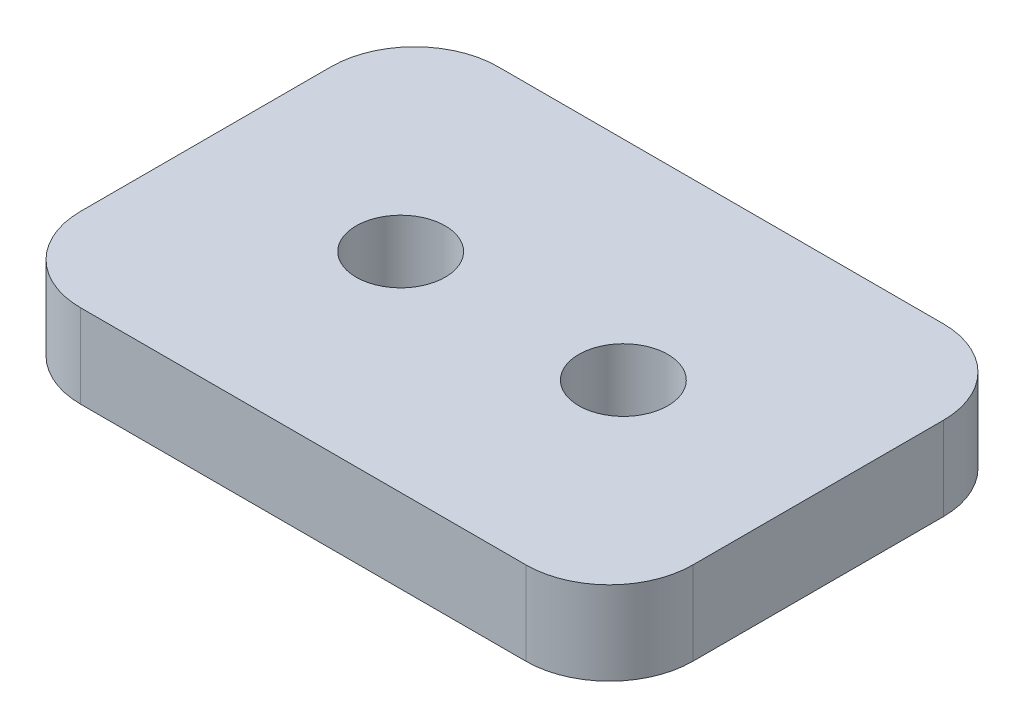
ISO-10303-21;
HEADER;
FILE_DESCRIPTION(('STEP AP214'),'2;1');
FILE_NAME('part.step','',(''),(''),'','','');
FILE_SCHEMA(('AUTOMOTIVE_DESIGN { 1 0 10303 214 1 1 1 1 }'));
ENDSEC;
DATA;
#1=APPLICATION_CONTEXT('core data for automotive mechanical design processes');
#2=APPLICATION_PROTOCOL_DEFINITION('international standard','automotive_design',2000,#1);
#3=PRODUCT_CONTEXT('',#1,'mechanical');
#4=PRODUCT('Part','Part','',(#3));
#5=PRODUCT_RELATED_PRODUCT_CATEGORY('part','',(#4));
#6=PRODUCT_DEFINITION_FORMATION('','',#4);
#7=PRODUCT_DEFINITION_CONTEXT('part definition',#1,'design');
#8=PRODUCT_DEFINITION('design','',#6,#7);
#9=PRODUCT_DEFINITION_SHAPE('','',#8);
#10=(LENGTH_UNIT() NAMED_UNIT(*) SI_UNIT(.MILLI.,.METRE.));
#11=(NAMED_UNIT(*) PLANE_ANGLE_UNIT() SI_UNIT($,.RADIAN.));
#12=(NAMED_UNIT(*) SI_UNIT($,.STERADIAN.) SOLID_ANGLE_UNIT());
#13=UNCERTAINTY_MEASURE_WITH_UNIT(LENGTH_MEASURE(1.E-05),#10,'distance_accuracy_value','');
#14=(GEOMETRIC_REPRESENTATION_CONTEXT(3) GLOBAL_UNCERTAINTY_ASSIGNED_CONTEXT((#13)) GLOBAL_UNIT_ASSIGNED_CONTEXT((#10,
#11,#12)) REPRESENTATION_CONTEXT('',''));
#15=CARTESIAN_POINT('',(0.,0.,0.));
#16=DIRECTION('',(0.,0.,1.));
#17=DIRECTION('',(1.,0.,0.));
#18=AXIS2_PLACEMENT_3D('',#15,#16,#17);
#19=CARTESIAN_POINT('',(0.,3.,0.));
#20=DIRECTION('',(0.,-1.,0.));
#21=DIRECTION('',(0.,0.,-1.));
#22=AXIS2_PLACEMENT_3D('',#19,#20,#21);
#23=PLANE('',#22);
#24=DIRECTION('',(0.,0.,1.));
#25=VECTOR('',#24,1.);
#26=CARTESIAN_POINT('',(-11.,3.,7.5));
#27=LINE('',#26,#25);
#28=CARTESIAN_POINT('',(-11.,3.,-4.5));
#29=VERTEX_POINT('',#28);
#30=CARTESIAN_POINT('',(-11.,3.,4.5));
#31=VERTEX_POINT('',#30);
#32=EDGE_CURVE('E181',#29,#31,#27,.T.);
#33=ORIENTED_EDGE('',*,*,#32,.T.);
#34=CARTESIAN_POINT('',(-8.,3.,4.5));
#35=DIRECTION('',(0.,-1.,0.));
#36=DIRECTION('',(0.,0.,-1.));
#37=AXIS2_PLACEMENT_3D('',#34,#35,#36);
#38=CIRCLE('',#37,3.);
#39=CARTESIAN_POINT('',(-8.,3.,7.5));
#40=VERTEX_POINT('',#39);
#41=EDGE_CURVE('E158',#31,#40,#38,.F.);
#42=ORIENTED_EDGE('',*,*,#41,.T.);
#43=DIRECTION('',(1.,0.,0.));
#44=VECTOR('',#43,1.);
#45=CARTESIAN_POINT('',(-11.,3.,7.5));
#46=LINE('',#45,#44);
#47=CARTESIAN_POINT('',(7.99999999999999,3.,7.5));
#48=VERTEX_POINT('',#47);
#49=EDGE_CURVE('E129',#40,#48,#46,.T.);
#50=ORIENTED_EDGE('',*,*,#49,.T.);
#51=CARTESIAN_POINT('',(8.,3.,4.5));
#52=DIRECTION('',(0.,-1.,0.));
#53=DIRECTION('',(0.,0.,-1.));
#54=AXIS2_PLACEMENT_3D('',#51,#52,#53);
#55=CIRCLE('',#54,3.);
#56=CARTESIAN_POINT('',(11.,3.,4.5));
#57=VERTEX_POINT('',#56);
#58=EDGE_CURVE('E153',#48,#57,#55,.F.);
#59=ORIENTED_EDGE('',*,*,#58,.T.);
#60=DIRECTION('',(0.,0.,-1.));
#61=VECTOR('',#60,1.);
#62=CARTESIAN_POINT('',(11.,3.,7.5));
#63=LINE('',#62,#61);
#64=CARTESIAN_POINT('',(11.,3.,-4.5));
#65=VERTEX_POINT('',#64);
#66=EDGE_CURVE('E136',#57,#65,#63,.T.);
#67=ORIENTED_EDGE('',*,*,#66,.T.);
#68=CARTESIAN_POINT('',(7.99999999999999,3.,-4.5));
#69=DIRECTION('',(0.,-1.,0.));
#70=DIRECTION('',(0.,0.,-1.));
#71=AXIS2_PLACEMENT_3D('',#68,#69,#70);
#72=CIRCLE('',#71,3.);
#73=CARTESIAN_POINT('',(7.99999999999999,3.,-7.5));
#74=VERTEX_POINT('',#73);
#75=EDGE_CURVE('E65',#65,#74,#72,.F.);
#76=ORIENTED_EDGE('',*,*,#75,.T.);
#77=DIRECTION('',(-1.,0.,0.));
#78=VECTOR('',#77,1.);
#79=CARTESIAN_POINT('',(-11.,3.,-7.5));
#80=LINE('',#79,#78);
#81=CARTESIAN_POINT('',(-8.,3.,-7.5));
#82=VERTEX_POINT('',#81);
#83=EDGE_CURVE('E139',#74,#82,#80,.T.);
#84=ORIENTED_EDGE('',*,*,#83,.T.);
#85=CARTESIAN_POINT('',(-8.,3.,-4.5));
#86=DIRECTION('',(0.,-1.,0.));
#87=DIRECTION('',(0.,0.,-1.));
#88=AXIS2_PLACEMENT_3D('',#85,#86,#87);
#89=CIRCLE('',#88,3.);
#90=EDGE_CURVE('E156',#82,#29,#89,.F.);
#91=ORIENTED_EDGE('',*,*,#90,.T.);
#92=EDGE_LOOP('',(#33,#42,#50,#59,#67,#76,#84,#91));
#93=FACE_BOUND('',#92,.T.);
#94=CARTESIAN_POINT('',(-4.,3.,0.));
#95=DIRECTION('',(0.,1.,0.));
#96=DIRECTION('',(0.,0.,1.));
#97=AXIS2_PLACEMENT_3D('',#94,#95,#96);
#98=CIRCLE('',#97,1.6);
#99=CARTESIAN_POINT('',(-4.,3.,1.6));
#100=VERTEX_POINT('',#99);
#101=EDGE_CURVE('E174',#100,#100,#98,.T.);
#102=ORIENTED_EDGE('',*,*,#101,.F.);
#103=EDGE_LOOP('',(#102));
#104=FACE_BOUND('',#103,.T.);
#105=CARTESIAN_POINT('',(4.,3.,0.));
#106=DIRECTION('',(0.,1.,0.));
#107=DIRECTION('',(0.,0.,1.));
#108=AXIS2_PLACEMENT_3D('',#105,#106,#107);
#109=CIRCLE('',#108,1.6);
#110=CARTESIAN_POINT('',(4.,3.,1.6));
#111=VERTEX_POINT('',#110);
#112=EDGE_CURVE('E186',#111,#111,#109,.T.);
#113=ORIENTED_EDGE('',*,*,#112,.F.);
#114=EDGE_LOOP('',(#113));
#115=FACE_BOUND('',#114,.T.);
#116=ADVANCED_FACE('F43',(#93,#104,#115),#23,.F.);
#117=CARTESIAN_POINT('',(0.,0.,0.));
#118=DIRECTION('',(0.,-1.,0.));
#119=DIRECTION('',(0.,0.,-1.));
#120=AXIS2_PLACEMENT_3D('',#117,#118,#119);
#121=PLANE('',#120);
#122=CARTESIAN_POINT('',(-4.,0.,0.));
#123=DIRECTION('',(0.,1.,0.));
#124=DIRECTION('',(0.,0.,1.));
#125=AXIS2_PLACEMENT_3D('',#122,#123,#124);
#126=CIRCLE('',#125,1.6);
#127=CARTESIAN_POINT('',(-4.,0.,1.6));
#128=VERTEX_POINT('',#127);
#129=EDGE_CURVE('E177',#128,#128,#126,.T.);
#130=ORIENTED_EDGE('',*,*,#129,.T.);
#131=EDGE_LOOP('',(#130));
#132=FACE_BOUND('',#131,.T.);
#133=DIRECTION('',(1.,0.,0.));
#134=VECTOR('',#133,1.);
#135=CARTESIAN_POINT('',(-11.,0.,7.5));
#136=LINE('',#135,#134);
#137=CARTESIAN_POINT('',(-8.,0.,7.5));
#138=VERTEX_POINT('',#137);
#139=CARTESIAN_POINT('',(7.99999999999999,0.,7.5));
#140=VERTEX_POINT('',#139);
#141=EDGE_CURVE('E126',#138,#140,#136,.T.);
#142=ORIENTED_EDGE('',*,*,#141,.F.);
#143=CARTESIAN_POINT('',(-8.,0.,4.5));
#144=DIRECTION('',(0.,-1.,0.));
#145=DIRECTION('',(0.,0.,-1.));
#146=AXIS2_PLACEMENT_3D('',#143,#144,#145);
#147=CIRCLE('',#146,3.);
#148=CARTESIAN_POINT('',(-11.,0.,4.5));
#149=VERTEX_POINT('',#148);
#150=EDGE_CURVE('E109',#138,#149,#147,.T.);
#151=ORIENTED_EDGE('',*,*,#150,.T.);
#152=DIRECTION('',(0.,0.,1.));
#153=VECTOR('',#152,1.);
#154=CARTESIAN_POINT('',(-11.,0.,7.5));
#155=LINE('',#154,#153);
#156=CARTESIAN_POINT('',(-11.,0.,-4.5));
#157=VERTEX_POINT('',#156);
#158=EDGE_CURVE('E137',#157,#149,#155,.T.);
#159=ORIENTED_EDGE('',*,*,#158,.F.);
#160=CARTESIAN_POINT('',(-8.,0.,-4.5));
#161=DIRECTION('',(0.,-1.,0.));
#162=DIRECTION('',(0.,0.,-1.));
#163=AXIS2_PLACEMENT_3D('',#160,#161,#162);
#164=CIRCLE('',#163,3.);
#165=CARTESIAN_POINT('',(-8.,0.,-7.5));
#166=VERTEX_POINT('',#165);
#167=EDGE_CURVE('E120',#157,#166,#164,.T.);
#168=ORIENTED_EDGE('',*,*,#167,.T.);
#169=DIRECTION('',(-1.,0.,0.));
#170=VECTOR('',#169,1.);
#171=CARTESIAN_POINT('',(-11.,0.,-7.5));
#172=LINE('',#171,#170);
#173=CARTESIAN_POINT('',(7.99999999999999,0.,-7.5));
#174=VERTEX_POINT('',#173);
#175=EDGE_CURVE('E141',#174,#166,#172,.T.);
#176=ORIENTED_EDGE('',*,*,#175,.F.);
#177=CARTESIAN_POINT('',(7.99999999999999,0.,-4.5));
#178=DIRECTION('',(0.,-1.,0.));
#179=DIRECTION('',(0.,0.,-1.));
#180=AXIS2_PLACEMENT_3D('',#177,#178,#179);
#181=CIRCLE('',#180,3.);
#182=CARTESIAN_POINT('',(11.,0.,-4.5));
#183=VERTEX_POINT('',#182);
#184=EDGE_CURVE('E147',#174,#183,#181,.T.);
#185=ORIENTED_EDGE('',*,*,#184,.T.);
#186=DIRECTION('',(0.,0.,-1.));
#187=VECTOR('',#186,1.);
#188=CARTESIAN_POINT('',(11.,0.,7.5));
#189=LINE('',#188,#187);
#190=CARTESIAN_POINT('',(11.,0.,4.5));
#191=VERTEX_POINT('',#190);
#192=EDGE_CURVE('E169',#191,#183,#189,.T.);
#193=ORIENTED_EDGE('',*,*,#192,.F.);
#194=CARTESIAN_POINT('',(8.,0.,4.5));
#195=DIRECTION('',(0.,-1.,0.));
#196=DIRECTION('',(0.,0.,-1.));
#197=AXIS2_PLACEMENT_3D('',#194,#195,#196);
#198=CIRCLE('',#197,3.);
#199=EDGE_CURVE('E130',#191,#140,#198,.T.);
#200=ORIENTED_EDGE('',*,*,#199,.T.);
#201=EDGE_LOOP('',(#142,#151,#159,#168,#176,#185,#193,#200));
#202=FACE_BOUND('',#201,.T.);
#203=CARTESIAN_POINT('',(4.,0.,0.));
#204=DIRECTION('',(0.,1.,0.));
#205=DIRECTION('',(0.,0.,1.));
#206=AXIS2_PLACEMENT_3D('',#203,#204,#205);
#207=CIRCLE('',#206,1.6);
#208=CARTESIAN_POINT('',(4.,0.,1.6));
#209=VERTEX_POINT('',#208);
#210=EDGE_CURVE('E188',#209,#209,#207,.T.);
#211=ORIENTED_EDGE('',*,*,#210,.T.);
#212=EDGE_LOOP('',(#211));
#213=FACE_BOUND('',#212,.T.);
#214=ADVANCED_FACE('F133',(#132,#202,#213),#121,.T.);
#215=CARTESIAN_POINT('',(11.,3.,7.5));
#216=DIRECTION('',(-1.,0.,0.));
#217=DIRECTION('',(0.,0.,1.));
#218=AXIS2_PLACEMENT_3D('',#215,#216,#217);
#219=PLANE('',#218);
#220=ORIENTED_EDGE('',*,*,#192,.T.);
#221=DIRECTION('',(0.,-1.,0.));
#222=VECTOR('',#221,1.);
#223=CARTESIAN_POINT('',(11.,3.,-4.5));
#224=LINE('',#223,#222);
#225=EDGE_CURVE('E11',#183,#65,#224,.F.);
#226=ORIENTED_EDGE('',*,*,#225,.T.);
#227=ORIENTED_EDGE('',*,*,#66,.F.);
#228=DIRECTION('',(0.,-1.,0.));
#229=VECTOR('',#228,1.);
#230=CARTESIAN_POINT('',(11.,3.,4.5));
#231=LINE('',#230,#229);
#232=EDGE_CURVE('E51',#57,#191,#231,.T.);
#233=ORIENTED_EDGE('',*,*,#232,.T.);
#234=EDGE_LOOP('',(#220,#226,#227,#233));
#235=FACE_BOUND('',#234,.T.);
#236=ADVANCED_FACE('F168',(#235),#219,.F.);
#237=CARTESIAN_POINT('',(-11.,3.,-7.5));
#238=DIRECTION('',(0.,0.,1.));
#239=DIRECTION('',(1.,0.,0.));
#240=AXIS2_PLACEMENT_3D('',#237,#238,#239);
#241=PLANE('',#240);
#242=ORIENTED_EDGE('',*,*,#175,.T.);
#243=DIRECTION('',(0.,-1.,0.));
#244=VECTOR('',#243,1.);
#245=CARTESIAN_POINT('',(-8.,3.,-7.5));
#246=LINE('',#245,#244);
#247=EDGE_CURVE('E58',#166,#82,#246,.F.);
#248=ORIENTED_EDGE('',*,*,#247,.T.);
#249=ORIENTED_EDGE('',*,*,#83,.F.);
#250=DIRECTION('',(0.,-1.,0.));
#251=VECTOR('',#250,1.);
#252=CARTESIAN_POINT('',(7.99999999999999,3.,-7.5));
#253=LINE('',#252,#251);
#254=EDGE_CURVE('E160',#74,#174,#253,.T.);
#255=ORIENTED_EDGE('',*,*,#254,.T.);
#256=EDGE_LOOP('',(#242,#248,#249,#255));
#257=FACE_BOUND('',#256,.T.);
#258=ADVANCED_FACE('F213',(#257),#241,.F.);
#259=CARTESIAN_POINT('',(-11.,3.,7.5));
#260=DIRECTION('',(1.,0.,0.));
#261=DIRECTION('',(0.,0.,-1.));
#262=AXIS2_PLACEMENT_3D('',#259,#260,#261);
#263=PLANE('',#262);
#264=ORIENTED_EDGE('',*,*,#158,.T.);
#265=DIRECTION('',(0.,-1.,0.));
#266=VECTOR('',#265,1.);
#267=CARTESIAN_POINT('',(-11.,3.,4.5));
#268=LINE('',#267,#266);
#269=EDGE_CURVE('E114',#149,#31,#268,.F.);
#270=ORIENTED_EDGE('',*,*,#269,.T.);
#271=ORIENTED_EDGE('',*,*,#32,.F.);
#272=DIRECTION('',(0.,-1.,0.));
#273=VECTOR('',#272,1.);
#274=CARTESIAN_POINT('',(-11.,3.,-4.5));
#275=LINE('',#274,#273);
#276=EDGE_CURVE('E119',#29,#157,#275,.T.);
#277=ORIENTED_EDGE('',*,*,#276,.T.);
#278=EDGE_LOOP('',(#264,#270,#271,#277));
#279=FACE_BOUND('',#278,.T.);
#280=ADVANCED_FACE('F210',(#279),#263,.F.);
#281=CARTESIAN_POINT('',(-11.,3.,7.5));
#282=DIRECTION('',(0.,0.,-1.));
#283=DIRECTION('',(-1.,0.,0.));
#284=AXIS2_PLACEMENT_3D('',#281,#282,#283);
#285=PLANE('',#284);
#286=ORIENTED_EDGE('',*,*,#49,.F.);
#287=DIRECTION('',(0.,-1.,0.));
#288=VECTOR('',#287,1.);
#289=CARTESIAN_POINT('',(-8.,3.,7.5));
#290=LINE('',#289,#288);
#291=EDGE_CURVE('E113',#40,#138,#290,.T.);
#292=ORIENTED_EDGE('',*,*,#291,.T.);
#293=ORIENTED_EDGE('',*,*,#141,.T.);
#294=DIRECTION('',(0.,-1.,0.));
#295=VECTOR('',#294,1.);
#296=CARTESIAN_POINT('',(7.99999999999999,3.,7.5));
#297=LINE('',#296,#295);
#298=EDGE_CURVE('E131',#140,#48,#297,.F.);
#299=ORIENTED_EDGE('',*,*,#298,.T.);
#300=EDGE_LOOP('',(#286,#292,#293,#299));
#301=FACE_BOUND('',#300,.T.);
#302=ADVANCED_FACE('F125',(#301),#285,.F.);
#303=CARTESIAN_POINT('',(-4.,3.,0.));
#304=DIRECTION('',(0.,-1.,0.));
#305=DIRECTION('',(0.,0.,-1.));
#306=AXIS2_PLACEMENT_3D('',#303,#304,#305);
#307=CYLINDRICAL_SURFACE('',#306,1.6);
#308=ORIENTED_EDGE('',*,*,#101,.T.);
#309=EDGE_LOOP('',(#308));
#310=FACE_BOUND('',#309,.T.);
#311=ORIENTED_EDGE('',*,*,#129,.F.);
#312=EDGE_LOOP('',(#311));
#313=FACE_BOUND('',#312,.T.);
#314=ADVANCED_FACE('F205',(#310,#313),#307,.F.);
#315=CARTESIAN_POINT('',(4.,3.,0.));
#316=DIRECTION('',(0.,-1.,0.));
#317=DIRECTION('',(0.,0.,-1.));
#318=AXIS2_PLACEMENT_3D('',#315,#316,#317);
#319=CYLINDRICAL_SURFACE('',#318,1.6);
#320=ORIENTED_EDGE('',*,*,#112,.T.);
#321=EDGE_LOOP('',(#320));
#322=FACE_BOUND('',#321,.T.);
#323=ORIENTED_EDGE('',*,*,#210,.F.);
#324=EDGE_LOOP('',(#323));
#325=FACE_BOUND('',#324,.T.);
#326=ADVANCED_FACE('F194',(#322,#325),#319,.F.);
#327=CARTESIAN_POINT('',(-8.,3.,4.5));
#328=DIRECTION('',(0.,-1.,0.));
#329=DIRECTION('',(0.,0.,-1.));
#330=AXIS2_PLACEMENT_3D('',#327,#328,#329);
#331=CYLINDRICAL_SURFACE('',#330,3.);
#332=ORIENTED_EDGE('',*,*,#41,.F.);
#333=ORIENTED_EDGE('',*,*,#269,.F.);
#334=ORIENTED_EDGE('',*,*,#150,.F.);
#335=ORIENTED_EDGE('',*,*,#291,.F.);
#336=EDGE_LOOP('',(#332,#333,#334,#335));
#337=FACE_BOUND('',#336,.T.);
#338=ADVANCED_FACE('F112',(#337),#331,.T.);
#339=CARTESIAN_POINT('',(-8.,3.,-4.5));
#340=DIRECTION('',(0.,-1.,0.));
#341=DIRECTION('',(0.,0.,-1.));
#342=AXIS2_PLACEMENT_3D('',#339,#340,#341);
#343=CYLINDRICAL_SURFACE('',#342,3.);
#344=ORIENTED_EDGE('',*,*,#90,.F.);
#345=ORIENTED_EDGE('',*,*,#247,.F.);
#346=ORIENTED_EDGE('',*,*,#167,.F.);
#347=ORIENTED_EDGE('',*,*,#276,.F.);
#348=EDGE_LOOP('',(#344,#345,#346,#347));
#349=FACE_BOUND('',#348,.T.);
#350=ADVANCED_FACE('F221',(#349),#343,.T.);
#351=CARTESIAN_POINT('',(7.99999999999999,3.,-4.5));
#352=DIRECTION('',(0.,-1.,0.));
#353=DIRECTION('',(0.,0.,-1.));
#354=AXIS2_PLACEMENT_3D('',#351,#352,#353);
#355=CYLINDRICAL_SURFACE('',#354,3.);
#356=ORIENTED_EDGE('',*,*,#75,.F.);
#357=ORIENTED_EDGE('',*,*,#225,.F.);
#358=ORIENTED_EDGE('',*,*,#184,.F.);
#359=ORIENTED_EDGE('',*,*,#254,.F.);
#360=EDGE_LOOP('',(#356,#357,#358,#359));
#361=FACE_BOUND('',#360,.T.);
#362=ADVANCED_FACE('F223',(#361),#355,.T.);
#363=CARTESIAN_POINT('',(8.,3.,4.5));
#364=DIRECTION('',(0.,-1.,0.));
#365=DIRECTION('',(0.,0.,-1.));
#366=AXIS2_PLACEMENT_3D('',#363,#364,#365);
#367=CYLINDRICAL_SURFACE('',#366,3.);
#368=ORIENTED_EDGE('',*,*,#58,.F.);
#369=ORIENTED_EDGE('',*,*,#298,.F.);
#370=ORIENTED_EDGE('',*,*,#199,.F.);
#371=ORIENTED_EDGE('',*,*,#232,.F.);
#372=EDGE_LOOP('',(#368,#369,#370,#371));
#373=FACE_BOUND('',#372,.T.);
#374=ADVANCED_FACE('F45',(#373),#367,.T.);
#375=CLOSED_SHELL('',(#116,#214,#236,#258,#280,#302,#314,#326,#338,#350,#362,#374));
#376=MANIFOLD_SOLID_BREP('B2',#375);
#377=ADVANCED_BREP_SHAPE_REPRESENTATION('',(#18,#376),#14);
#378=SHAPE_DEFINITION_REPRESENTATION(#9,#377);
ENDSEC;
END-ISO-10303-21;
